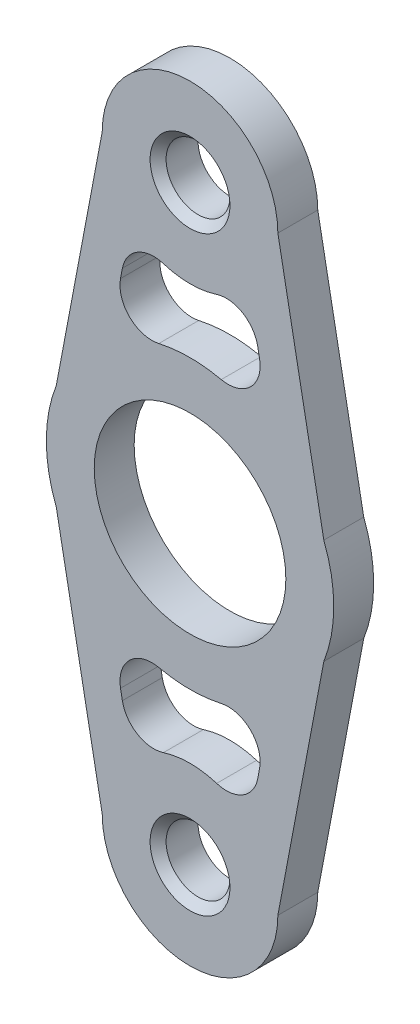
ISO-10303-21;
HEADER;
FILE_DESCRIPTION(('STEP AP214'),'2;1');
FILE_NAME('part.step','',(''),(''),'','','');
FILE_SCHEMA(('AUTOMOTIVE_DESIGN { 1 0 10303 214 1 1 1 1 }'));
ENDSEC;
DATA;
#1=APPLICATION_CONTEXT('core data for automotive mechanical design processes');
#2=APPLICATION_PROTOCOL_DEFINITION('international standard','automotive_design',2000,#1);
#3=PRODUCT_CONTEXT('',#1,'mechanical');
#4=PRODUCT('Part','Part','',(#3));
#5=PRODUCT_RELATED_PRODUCT_CATEGORY('part','',(#4));
#6=PRODUCT_DEFINITION_FORMATION('','',#4);
#7=PRODUCT_DEFINITION_CONTEXT('part definition',#1,'design');
#8=PRODUCT_DEFINITION('design','',#6,#7);
#9=PRODUCT_DEFINITION_SHAPE('','',#8);
#10=(LENGTH_UNIT() NAMED_UNIT(*) SI_UNIT(.MILLI.,.METRE.));
#11=(NAMED_UNIT(*) PLANE_ANGLE_UNIT() SI_UNIT($,.RADIAN.));
#12=(NAMED_UNIT(*) SI_UNIT($,.STERADIAN.) SOLID_ANGLE_UNIT());
#13=UNCERTAINTY_MEASURE_WITH_UNIT(LENGTH_MEASURE(1.E-05),#10,'distance_accuracy_value','');
#14=(GEOMETRIC_REPRESENTATION_CONTEXT(3) GLOBAL_UNCERTAINTY_ASSIGNED_CONTEXT((#13)) GLOBAL_UNIT_ASSIGNED_CONTEXT((#10,
#11,#12)) REPRESENTATION_CONTEXT('',''));
#15=CARTESIAN_POINT('',(0.,0.,0.));
#16=DIRECTION('',(0.,0.,1.));
#17=DIRECTION('',(1.,0.,0.));
#18=AXIS2_PLACEMENT_3D('',#15,#16,#17);
#19=CARTESIAN_POINT('',(0.,37.,5.));
#20=DIRECTION('',(0.,0.,1.));
#21=DIRECTION('',(1.,0.,0.));
#22=AXIS2_PLACEMENT_3D('',#19,#20,#21);
#23=PLANE('',#22);
#24=CARTESIAN_POINT('',(0.,-37.,5.));
#25=DIRECTION('',(0.,0.,1.));
#26=DIRECTION('',(1.,0.,0.));
#27=AXIS2_PLACEMENT_3D('',#24,#25,#26);
#28=CIRCLE('',#27,5.00000000000002);
#29=CARTESIAN_POINT('',(5.00000000000002,-37.,5.));
#30=VERTEX_POINT('',#29);
#31=EDGE_CURVE('E50',#30,#30,#28,.F.);
#32=ORIENTED_EDGE('',*,*,#31,.T.);
#33=EDGE_LOOP('',(#32));
#34=FACE_BOUND('',#33,.T.);
#35=CARTESIAN_POINT('',(0.,37.,5.));
#36=DIRECTION('',(0.,0.,1.));
#37=DIRECTION('',(1.,0.,0.));
#38=AXIS2_PLACEMENT_3D('',#35,#36,#37);
#39=CIRCLE('',#38,5.00000000000002);
#40=CARTESIAN_POINT('',(5.00000000000002,37.,5.));
#41=VERTEX_POINT('',#40);
#42=EDGE_CURVE('E399',#41,#41,#39,.F.);
#43=ORIENTED_EDGE('',*,*,#42,.T.);
#44=EDGE_LOOP('',(#43));
#45=FACE_BOUND('',#44,.T.);
#46=CARTESIAN_POINT('',(0.,0.,5.));
#47=DIRECTION('',(0.,0.,-1.));
#48=DIRECTION('',(1.,0.,0.));
#49=AXIS2_PLACEMENT_3D('',#46,#47,#48);
#50=CIRCLE('',#49,18.);
#51=CARTESIAN_POINT('',(3.90887412794151,-17.570449711146,5.));
#52=VERTEX_POINT('',#51);
#53=CARTESIAN_POINT('',(-3.90887412794152,-17.570449711146,5.));
#54=VERTEX_POINT('',#53);
#55=EDGE_CURVE('E211',#52,#54,#50,.T.);
#56=ORIENTED_EDGE('',*,*,#55,.F.);
#57=CARTESIAN_POINT('',(4.77751282303963,-21.4749940914006,5.));
#58=DIRECTION('',(0.,0.,1.));
#59=DIRECTION('',(1.,0.,0.));
#60=AXIS2_PLACEMENT_3D('',#57,#58,#59);
#61=CIRCLE('',#60,4.);
#62=CARTESIAN_POINT('',(8.7077938058279,-22.21856076382,5.));
#63=VERTEX_POINT('',#62);
#64=EDGE_CURVE('E203',#63,#52,#61,.T.);
#65=ORIENTED_EDGE('',*,*,#64,.F.);
#66=DIRECTION('',(0.185891668104852,0.982570245697068,0.));
#67=VECTOR('',#66,1.);
#68=CARTESIAN_POINT('',(8.47507554235507,-23.448643013605,5.));
#69=LINE('',#68,#67);
#70=CARTESIAN_POINT('',(8.47507554235507,-23.448643013605,5.));
#71=VERTEX_POINT('',#70);
#72=EDGE_CURVE('E238',#71,#63,#69,.T.);
#73=ORIENTED_EDGE('',*,*,#72,.F.);
#74=CARTESIAN_POINT('',(4.54479455956681,-22.7050763411856,5.));
#75=DIRECTION('',(0.,0.,1.));
#76=DIRECTION('',(1.,0.,0.));
#77=AXIS2_PLACEMENT_3D('',#74,#75,#76);
#78=CIRCLE('',#77,4.);
#79=CARTESIAN_POINT('',(3.33284934368232,-26.5170559835361,5.));
#80=VERTEX_POINT('',#79);
#81=EDGE_CURVE('E236',#80,#71,#78,.T.);
#82=ORIENTED_EDGE('',*,*,#81,.F.);
#83=CARTESIAN_POINT('',(0.,-37.,5.));
#84=DIRECTION('',(0.,0.,-1.));
#85=DIRECTION('',(-1.,0.,0.));
#86=AXIS2_PLACEMENT_3D('',#83,#84,#85);
#87=CIRCLE('',#86,11.);
#88=CARTESIAN_POINT('',(-3.33284934368232,-26.5170559835361,5.));
#89=VERTEX_POINT('',#88);
#90=EDGE_CURVE('E234',#89,#80,#87,.T.);
#91=ORIENTED_EDGE('',*,*,#90,.F.);
#92=CARTESIAN_POINT('',(-4.54479455956681,-22.7050763411856,5.));
#93=DIRECTION('',(0.,0.,1.));
#94=DIRECTION('',(-1.,0.,0.));
#95=AXIS2_PLACEMENT_3D('',#92,#93,#94);
#96=CIRCLE('',#95,4.);
#97=CARTESIAN_POINT('',(-8.47507554235507,-23.448643013605,5.));
#98=VERTEX_POINT('',#97);
#99=EDGE_CURVE('E232',#98,#89,#96,.T.);
#100=ORIENTED_EDGE('',*,*,#99,.F.);
#101=DIRECTION('',(0.185891668104852,-0.982570245697068,0.));
#102=VECTOR('',#101,1.);
#103=CARTESIAN_POINT('',(-8.47507554235507,-23.448643013605,5.));
#104=LINE('',#103,#102);
#105=CARTESIAN_POINT('',(-8.7077938058279,-22.21856076382,5.));
#106=VERTEX_POINT('',#105);
#107=EDGE_CURVE('E227',#106,#98,#104,.T.);
#108=ORIENTED_EDGE('',*,*,#107,.F.);
#109=CARTESIAN_POINT('',(-4.77751282303963,-21.4749940914006,5.));
#110=DIRECTION('',(0.,0.,1.));
#111=DIRECTION('',(-1.,0.,0.));
#112=AXIS2_PLACEMENT_3D('',#109,#110,#111);
#113=CIRCLE('',#112,4.);
#114=EDGE_CURVE('E225',#54,#106,#113,.T.);
#115=ORIENTED_EDGE('',*,*,#114,.F.);
#116=EDGE_LOOP('',(#56,#65,#73,#82,#91,#100,#108,#115));
#117=FACE_BOUND('',#116,.T.);
#118=CARTESIAN_POINT('',(0.,37.,5.));
#119=DIRECTION('',(0.,0.,-1.));
#120=DIRECTION('',(1.,0.,0.));
#121=AXIS2_PLACEMENT_3D('',#118,#119,#120);
#122=CIRCLE('',#121,11.);
#123=CARTESIAN_POINT('',(3.33284934368232,26.5170559835361,5.));
#124=VERTEX_POINT('',#123);
#125=CARTESIAN_POINT('',(-3.33284934368233,26.5170559835361,5.));
#126=VERTEX_POINT('',#125);
#127=EDGE_CURVE('E273',#124,#126,#122,.T.);
#128=ORIENTED_EDGE('',*,*,#127,.F.);
#129=CARTESIAN_POINT('',(4.54479455956681,22.7050763411856,5.));
#130=DIRECTION('',(0.,0.,1.));
#131=DIRECTION('',(-1.,0.,0.));
#132=AXIS2_PLACEMENT_3D('',#129,#130,#131);
#133=CIRCLE('',#132,4.);
#134=CARTESIAN_POINT('',(8.47507554235507,23.448643013605,5.));
#135=VERTEX_POINT('',#134);
#136=EDGE_CURVE('E271',#135,#124,#133,.T.);
#137=ORIENTED_EDGE('',*,*,#136,.F.);
#138=DIRECTION('',(-0.185891668104852,0.982570245697068,0.));
#139=VECTOR('',#138,1.);
#140=CARTESIAN_POINT('',(8.47507554235507,23.448643013605,5.));
#141=LINE('',#140,#139);
#142=CARTESIAN_POINT('',(8.7077938058279,22.21856076382,5.));
#143=VERTEX_POINT('',#142);
#144=EDGE_CURVE('E287',#143,#135,#141,.T.);
#145=ORIENTED_EDGE('',*,*,#144,.F.);
#146=CARTESIAN_POINT('',(4.77751282303963,21.4749940914006,5.));
#147=DIRECTION('',(0.,0.,1.));
#148=DIRECTION('',(-1.,0.,0.));
#149=AXIS2_PLACEMENT_3D('',#146,#147,#148);
#150=CIRCLE('',#149,4.);
#151=CARTESIAN_POINT('',(3.90887412794152,17.570449711146,5.));
#152=VERTEX_POINT('',#151);
#153=EDGE_CURVE('E284',#152,#143,#150,.T.);
#154=ORIENTED_EDGE('',*,*,#153,.F.);
#155=CARTESIAN_POINT('',(0.,0.,5.));
#156=DIRECTION('',(0.,0.,-1.));
#157=DIRECTION('',(1.,0.,0.));
#158=AXIS2_PLACEMENT_3D('',#155,#156,#157);
#159=CIRCLE('',#158,18.);
#160=CARTESIAN_POINT('',(-3.90887412794152,17.570449711146,5.));
#161=VERTEX_POINT('',#160);
#162=EDGE_CURVE('E282',#161,#152,#159,.T.);
#163=ORIENTED_EDGE('',*,*,#162,.F.);
#164=CARTESIAN_POINT('',(-4.77751282303963,21.4749940914006,5.));
#165=DIRECTION('',(0.,0.,1.));
#166=DIRECTION('',(1.,0.,0.));
#167=AXIS2_PLACEMENT_3D('',#164,#165,#166);
#168=CIRCLE('',#167,4.);
#169=CARTESIAN_POINT('',(-8.7077938058279,22.21856076382,5.));
#170=VERTEX_POINT('',#169);
#171=EDGE_CURVE('E280',#170,#161,#168,.T.);
#172=ORIENTED_EDGE('',*,*,#171,.F.);
#173=DIRECTION('',(-0.185891668104852,-0.982570245697068,0.));
#174=VECTOR('',#173,1.);
#175=CARTESIAN_POINT('',(-8.47507554235507,23.448643013605,5.));
#176=LINE('',#175,#174);
#177=CARTESIAN_POINT('',(-8.47507554235507,23.448643013605,5.));
#178=VERTEX_POINT('',#177);
#179=EDGE_CURVE('E278',#178,#170,#176,.T.);
#180=ORIENTED_EDGE('',*,*,#179,.F.);
#181=CARTESIAN_POINT('',(-4.54479455956681,22.7050763411856,5.));
#182=DIRECTION('',(0.,0.,1.));
#183=DIRECTION('',(1.,0.,0.));
#184=AXIS2_PLACEMENT_3D('',#181,#182,#183);
#185=CIRCLE('',#184,4.);
#186=EDGE_CURVE('E276',#126,#178,#185,.T.);
#187=ORIENTED_EDGE('',*,*,#186,.F.);
#188=EDGE_LOOP('',(#128,#137,#145,#154,#163,#172,#180,#187));
#189=FACE_BOUND('',#188,.T.);
#190=CARTESIAN_POINT('',(0.,37.,5.));
#191=DIRECTION('',(0.,0.,1.));
#192=DIRECTION('',(1.,0.,0.));
#193=AXIS2_PLACEMENT_3D('',#190,#191,#192);
#194=CIRCLE('',#193,11.);
#195=CARTESIAN_POINT('',(11.,37.,5.));
#196=VERTEX_POINT('',#195);
#197=CARTESIAN_POINT('',(-11.,37.,5.));
#198=VERTEX_POINT('',#197);
#199=EDGE_CURVE('E339',#196,#198,#194,.T.);
#200=ORIENTED_EDGE('',*,*,#199,.T.);
#201=DIRECTION('',(-0.185891668104851,-0.982570245697068,0.));
#202=VECTOR('',#201,1.);
#203=CARTESIAN_POINT('',(-16.7559943582511,6.57545839210155,5.));
#204=LINE('',#203,#202);
#205=CARTESIAN_POINT('',(-16.7559943582511,6.57545839210155,5.));
#206=VERTEX_POINT('',#205);
#207=EDGE_CURVE('E342',#198,#206,#204,.T.);
#208=ORIENTED_EDGE('',*,*,#207,.T.);
#209=CARTESIAN_POINT('',(0.,0.,5.));
#210=DIRECTION('',(0.,0.,1.));
#211=DIRECTION('',(1.,0.,0.));
#212=AXIS2_PLACEMENT_3D('',#209,#210,#211);
#213=CIRCLE('',#212,18.);
#214=CARTESIAN_POINT('',(-16.7559943582511,-6.57545839210154,5.));
#215=VERTEX_POINT('',#214);
#216=EDGE_CURVE('E345',#206,#215,#213,.T.);
#217=ORIENTED_EDGE('',*,*,#216,.T.);
#218=DIRECTION('',(0.185891668104851,-0.982570245697068,0.));
#219=VECTOR('',#218,1.);
#220=CARTESIAN_POINT('',(-16.7559943582511,-6.57545839210154,5.));
#221=LINE('',#220,#219);
#222=CARTESIAN_POINT('',(-11.,-37.,5.));
#223=VERTEX_POINT('',#222);
#224=EDGE_CURVE('E347',#215,#223,#221,.T.);
#225=ORIENTED_EDGE('',*,*,#224,.T.);
#226=CARTESIAN_POINT('',(0.,-37.,5.));
#227=DIRECTION('',(0.,0.,1.));
#228=DIRECTION('',(-1.,0.,0.));
#229=AXIS2_PLACEMENT_3D('',#226,#227,#228);
#230=CIRCLE('',#229,11.);
#231=CARTESIAN_POINT('',(11.,-37.,5.));
#232=VERTEX_POINT('',#231);
#233=EDGE_CURVE('E349',#223,#232,#230,.T.);
#234=ORIENTED_EDGE('',*,*,#233,.T.);
#235=DIRECTION('',(0.185891668104851,0.982570245697068,0.));
#236=VECTOR('',#235,1.);
#237=CARTESIAN_POINT('',(16.7559943582511,-6.57545839210155,5.));
#238=LINE('',#237,#236);
#239=CARTESIAN_POINT('',(16.7559943582511,-6.57545839210155,5.));
#240=VERTEX_POINT('',#239);
#241=EDGE_CURVE('E351',#232,#240,#238,.T.);
#242=ORIENTED_EDGE('',*,*,#241,.T.);
#243=CARTESIAN_POINT('',(0.,0.,5.));
#244=DIRECTION('',(0.,0.,1.));
#245=DIRECTION('',(1.,0.,0.));
#246=AXIS2_PLACEMENT_3D('',#243,#244,#245);
#247=CIRCLE('',#246,18.);
#248=CARTESIAN_POINT('',(16.7559943582511,6.57545839210154,5.));
#249=VERTEX_POINT('',#248);
#250=EDGE_CURVE('E353',#240,#249,#247,.T.);
#251=ORIENTED_EDGE('',*,*,#250,.T.);
#252=DIRECTION('',(-0.185891668104851,0.982570245697068,0.));
#253=VECTOR('',#252,1.);
#254=CARTESIAN_POINT('',(16.7559943582511,6.57545839210155,5.));
#255=LINE('',#254,#253);
#256=EDGE_CURVE('E355',#249,#196,#255,.T.);
#257=ORIENTED_EDGE('',*,*,#256,.T.);
#258=EDGE_LOOP('',(#200,#208,#217,#225,#234,#242,#251,#257));
#259=FACE_BOUND('',#258,.T.);
#260=CARTESIAN_POINT('',(0.,0.,5.));
#261=DIRECTION('',(0.,0.,1.));
#262=DIRECTION('',(1.,0.,0.));
#263=AXIS2_PLACEMENT_3D('',#260,#261,#262);
#264=CIRCLE('',#263,12.);
#265=CARTESIAN_POINT('',(12.,0.,5.));
#266=VERTEX_POINT('',#265);
#267=EDGE_CURVE('E333',#266,#266,#264,.T.);
#268=ORIENTED_EDGE('',*,*,#267,.F.);
#269=EDGE_LOOP('',(#268));
#270=FACE_BOUND('',#269,.T.);
#271=ADVANCED_FACE('F41',(#34,#45,#117,#189,#259,#270),#23,.T.);
#272=CARTESIAN_POINT('',(0.,37.,0.));
#273=DIRECTION('',(0.,0.,1.));
#274=DIRECTION('',(1.,0.,0.));
#275=AXIS2_PLACEMENT_3D('',#272,#273,#274);
#276=PLANE('',#275);
#277=CARTESIAN_POINT('',(4.54479455956681,22.7050763411856,0.));
#278=DIRECTION('',(0.,0.,1.));
#279=DIRECTION('',(-1.,0.,0.));
#280=AXIS2_PLACEMENT_3D('',#277,#278,#279);
#281=CIRCLE('',#280,4.);
#282=CARTESIAN_POINT('',(8.47507554235507,23.448643013605,0.));
#283=VERTEX_POINT('',#282);
#284=CARTESIAN_POINT('',(3.33284934368232,26.5170559835361,0.));
#285=VERTEX_POINT('',#284);
#286=EDGE_CURVE('E219',#283,#285,#281,.T.);
#287=ORIENTED_EDGE('',*,*,#286,.T.);
#288=CARTESIAN_POINT('',(0.,37.,0.));
#289=DIRECTION('',(0.,0.,-1.));
#290=DIRECTION('',(1.,0.,0.));
#291=AXIS2_PLACEMENT_3D('',#288,#289,#290);
#292=CIRCLE('',#291,11.);
#293=CARTESIAN_POINT('',(-3.33284934368233,26.5170559835361,0.));
#294=VERTEX_POINT('',#293);
#295=EDGE_CURVE('E292',#285,#294,#292,.T.);
#296=ORIENTED_EDGE('',*,*,#295,.T.);
#297=CARTESIAN_POINT('',(-4.54479455956681,22.7050763411856,0.));
#298=DIRECTION('',(0.,0.,1.));
#299=DIRECTION('',(1.,0.,0.));
#300=AXIS2_PLACEMENT_3D('',#297,#298,#299);
#301=CIRCLE('',#300,4.);
#302=CARTESIAN_POINT('',(-8.47507554235507,23.448643013605,0.));
#303=VERTEX_POINT('',#302);
#304=EDGE_CURVE('E295',#294,#303,#301,.T.);
#305=ORIENTED_EDGE('',*,*,#304,.T.);
#306=DIRECTION('',(-0.185891668104852,-0.982570245697068,0.));
#307=VECTOR('',#306,1.);
#308=CARTESIAN_POINT('',(-8.47507554235507,23.448643013605,0.));
#309=LINE('',#308,#307);
#310=CARTESIAN_POINT('',(-8.7077938058279,22.21856076382,0.));
#311=VERTEX_POINT('',#310);
#312=EDGE_CURVE('E298',#303,#311,#309,.T.);
#313=ORIENTED_EDGE('',*,*,#312,.T.);
#314=CARTESIAN_POINT('',(-4.77751282303963,21.4749940914006,0.));
#315=DIRECTION('',(0.,0.,1.));
#316=DIRECTION('',(1.,0.,0.));
#317=AXIS2_PLACEMENT_3D('',#314,#315,#316);
#318=CIRCLE('',#317,4.);
#319=CARTESIAN_POINT('',(-3.90887412794152,17.570449711146,0.));
#320=VERTEX_POINT('',#319);
#321=EDGE_CURVE('E301',#311,#320,#318,.T.);
#322=ORIENTED_EDGE('',*,*,#321,.T.);
#323=CARTESIAN_POINT('',(0.,0.,0.));
#324=DIRECTION('',(0.,0.,-1.));
#325=DIRECTION('',(1.,0.,0.));
#326=AXIS2_PLACEMENT_3D('',#323,#324,#325);
#327=CIRCLE('',#326,18.);
#328=CARTESIAN_POINT('',(3.90887412794152,17.570449711146,0.));
#329=VERTEX_POINT('',#328);
#330=EDGE_CURVE('E304',#320,#329,#327,.T.);
#331=ORIENTED_EDGE('',*,*,#330,.T.);
#332=CARTESIAN_POINT('',(4.77751282303963,21.4749940914006,0.));
#333=DIRECTION('',(0.,0.,1.));
#334=DIRECTION('',(-1.,0.,0.));
#335=AXIS2_PLACEMENT_3D('',#332,#333,#334);
#336=CIRCLE('',#335,4.);
#337=CARTESIAN_POINT('',(8.7077938058279,22.21856076382,0.));
#338=VERTEX_POINT('',#337);
#339=EDGE_CURVE('E307',#329,#338,#336,.T.);
#340=ORIENTED_EDGE('',*,*,#339,.T.);
#341=DIRECTION('',(-0.185891668104852,0.982570245697068,0.));
#342=VECTOR('',#341,1.);
#343=CARTESIAN_POINT('',(8.47507554235507,23.448643013605,0.));
#344=LINE('',#343,#342);
#345=EDGE_CURVE('E274',#338,#283,#344,.T.);
#346=ORIENTED_EDGE('',*,*,#345,.T.);
#347=EDGE_LOOP('',(#287,#296,#305,#313,#322,#331,#340,#346));
#348=FACE_BOUND('',#347,.T.);
#349=CARTESIAN_POINT('',(0.,37.,0.));
#350=DIRECTION('',(0.,0.,1.));
#351=DIRECTION('',(1.,0.,0.));
#352=AXIS2_PLACEMENT_3D('',#349,#350,#351);
#353=CIRCLE('',#352,11.);
#354=CARTESIAN_POINT('',(11.,37.,0.));
#355=VERTEX_POINT('',#354);
#356=CARTESIAN_POINT('',(-11.,37.,0.));
#357=VERTEX_POINT('',#356);
#358=EDGE_CURVE('E336',#355,#357,#353,.T.);
#359=ORIENTED_EDGE('',*,*,#358,.F.);
#360=DIRECTION('',(-0.185891668104851,0.982570245697068,0.));
#361=VECTOR('',#360,1.);
#362=CARTESIAN_POINT('',(16.7559943582511,6.57545839210155,0.));
#363=LINE('',#362,#361);
#364=CARTESIAN_POINT('',(16.7559943582511,6.57545839210154,0.));
#365=VERTEX_POINT('',#364);
#366=EDGE_CURVE('E343',#365,#355,#363,.T.);
#367=ORIENTED_EDGE('',*,*,#366,.F.);
#368=CARTESIAN_POINT('',(0.,0.,0.));
#369=DIRECTION('',(0.,0.,1.));
#370=DIRECTION('',(1.,0.,0.));
#371=AXIS2_PLACEMENT_3D('',#368,#369,#370);
#372=CIRCLE('',#371,18.);
#373=CARTESIAN_POINT('',(16.7559943582511,-6.57545839210155,0.));
#374=VERTEX_POINT('',#373);
#375=EDGE_CURVE('E370',#374,#365,#372,.T.);
#376=ORIENTED_EDGE('',*,*,#375,.F.);
#377=DIRECTION('',(0.185891668104851,0.982570245697068,0.));
#378=VECTOR('',#377,1.);
#379=CARTESIAN_POINT('',(16.7559943582511,-6.57545839210155,0.));
#380=LINE('',#379,#378);
#381=CARTESIAN_POINT('',(11.,-37.,0.));
#382=VERTEX_POINT('',#381);
#383=EDGE_CURVE('E368',#382,#374,#380,.T.);
#384=ORIENTED_EDGE('',*,*,#383,.F.);
#385=CARTESIAN_POINT('',(0.,-37.,0.));
#386=DIRECTION('',(0.,0.,1.));
#387=DIRECTION('',(-1.,0.,0.));
#388=AXIS2_PLACEMENT_3D('',#385,#386,#387);
#389=CIRCLE('',#388,11.);
#390=CARTESIAN_POINT('',(-11.,-37.,0.));
#391=VERTEX_POINT('',#390);
#392=EDGE_CURVE('E366',#391,#382,#389,.T.);
#393=ORIENTED_EDGE('',*,*,#392,.F.);
#394=DIRECTION('',(0.185891668104851,-0.982570245697068,0.));
#395=VECTOR('',#394,1.);
#396=CARTESIAN_POINT('',(-16.7559943582511,-6.57545839210154,0.));
#397=LINE('',#396,#395);
#398=CARTESIAN_POINT('',(-16.7559943582511,-6.57545839210154,0.));
#399=VERTEX_POINT('',#398);
#400=EDGE_CURVE('E364',#399,#391,#397,.T.);
#401=ORIENTED_EDGE('',*,*,#400,.F.);
#402=CARTESIAN_POINT('',(0.,0.,0.));
#403=DIRECTION('',(0.,0.,1.));
#404=DIRECTION('',(1.,0.,0.));
#405=AXIS2_PLACEMENT_3D('',#402,#403,#404);
#406=CIRCLE('',#405,18.);
#407=CARTESIAN_POINT('',(-16.7559943582511,6.57545839210155,0.));
#408=VERTEX_POINT('',#407);
#409=EDGE_CURVE('E362',#408,#399,#406,.T.);
#410=ORIENTED_EDGE('',*,*,#409,.F.);
#411=DIRECTION('',(-0.185891668104851,-0.982570245697068,0.));
#412=VECTOR('',#411,1.);
#413=CARTESIAN_POINT('',(-16.7559943582511,6.57545839210155,0.));
#414=LINE('',#413,#412);
#415=EDGE_CURVE('E360',#357,#408,#414,.T.);
#416=ORIENTED_EDGE('',*,*,#415,.F.);
#417=EDGE_LOOP('',(#359,#367,#376,#384,#393,#401,#410,#416));
#418=FACE_BOUND('',#417,.T.);
#419=CARTESIAN_POINT('',(0.,0.,0.));
#420=DIRECTION('',(0.,0.,1.));
#421=DIRECTION('',(1.,0.,0.));
#422=AXIS2_PLACEMENT_3D('',#419,#420,#421);
#423=CIRCLE('',#422,12.);
#424=CARTESIAN_POINT('',(12.,0.,0.));
#425=VERTEX_POINT('',#424);
#426=EDGE_CURVE('E332',#425,#425,#423,.T.);
#427=ORIENTED_EDGE('',*,*,#426,.T.);
#428=EDGE_LOOP('',(#427));
#429=FACE_BOUND('',#428,.T.);
#430=CARTESIAN_POINT('',(0.,37.,0.));
#431=DIRECTION('',(0.,0.,1.));
#432=DIRECTION('',(1.,0.,0.));
#433=AXIS2_PLACEMENT_3D('',#430,#431,#432);
#434=CIRCLE('',#433,4.);
#435=CARTESIAN_POINT('',(4.,37.,0.));
#436=VERTEX_POINT('',#435);
#437=EDGE_CURVE('E329',#436,#436,#434,.T.);
#438=ORIENTED_EDGE('',*,*,#437,.T.);
#439=EDGE_LOOP('',(#438));
#440=FACE_BOUND('',#439,.T.);
#441=CARTESIAN_POINT('',(4.77751282303963,-21.4749940914006,0.));
#442=DIRECTION('',(0.,0.,1.));
#443=DIRECTION('',(1.,0.,0.));
#444=AXIS2_PLACEMENT_3D('',#441,#442,#443);
#445=CIRCLE('',#444,4.);
#446=CARTESIAN_POINT('',(8.7077938058279,-22.21856076382,0.));
#447=VERTEX_POINT('',#446);
#448=CARTESIAN_POINT('',(3.90887412794151,-17.570449711146,0.));
#449=VERTEX_POINT('',#448);
#450=EDGE_CURVE('E65',#447,#449,#445,.T.);
#451=ORIENTED_EDGE('',*,*,#450,.T.);
#452=CARTESIAN_POINT('',(0.,0.,0.));
#453=DIRECTION('',(0.,0.,-1.));
#454=DIRECTION('',(1.,0.,0.));
#455=AXIS2_PLACEMENT_3D('',#452,#453,#454);
#456=CIRCLE('',#455,18.);
#457=CARTESIAN_POINT('',(-3.90887412794152,-17.570449711146,0.));
#458=VERTEX_POINT('',#457);
#459=EDGE_CURVE('E218',#449,#458,#456,.T.);
#460=ORIENTED_EDGE('',*,*,#459,.T.);
#461=CARTESIAN_POINT('',(-4.77751282303963,-21.4749940914006,0.));
#462=DIRECTION('',(0.,0.,1.));
#463=DIRECTION('',(-1.,0.,0.));
#464=AXIS2_PLACEMENT_3D('',#461,#462,#463);
#465=CIRCLE('',#464,4.);
#466=CARTESIAN_POINT('',(-8.7077938058279,-22.21856076382,0.));
#467=VERTEX_POINT('',#466);
#468=EDGE_CURVE('E243',#458,#467,#465,.T.);
#469=ORIENTED_EDGE('',*,*,#468,.T.);
#470=DIRECTION('',(0.185891668104852,-0.982570245697068,0.));
#471=VECTOR('',#470,1.);
#472=CARTESIAN_POINT('',(-8.47507554235507,-23.448643013605,0.));
#473=LINE('',#472,#471);
#474=CARTESIAN_POINT('',(-8.47507554235507,-23.448643013605,0.));
#475=VERTEX_POINT('',#474);
#476=EDGE_CURVE('E246',#467,#475,#473,.T.);
#477=ORIENTED_EDGE('',*,*,#476,.T.);
#478=CARTESIAN_POINT('',(-4.54479455956681,-22.7050763411856,0.));
#479=DIRECTION('',(0.,0.,1.));
#480=DIRECTION('',(-1.,0.,0.));
#481=AXIS2_PLACEMENT_3D('',#478,#479,#480);
#482=CIRCLE('',#481,4.);
#483=CARTESIAN_POINT('',(-3.33284934368232,-26.5170559835361,0.));
#484=VERTEX_POINT('',#483);
#485=EDGE_CURVE('E249',#475,#484,#482,.T.);
#486=ORIENTED_EDGE('',*,*,#485,.T.);
#487=CARTESIAN_POINT('',(0.,-37.,0.));
#488=DIRECTION('',(0.,0.,-1.));
#489=DIRECTION('',(-1.,0.,0.));
#490=AXIS2_PLACEMENT_3D('',#487,#488,#489);
#491=CIRCLE('',#490,11.);
#492=CARTESIAN_POINT('',(3.33284934368232,-26.5170559835361,0.));
#493=VERTEX_POINT('',#492);
#494=EDGE_CURVE('E252',#484,#493,#491,.T.);
#495=ORIENTED_EDGE('',*,*,#494,.T.);
#496=CARTESIAN_POINT('',(4.54479455956681,-22.7050763411856,0.));
#497=DIRECTION('',(0.,0.,1.));
#498=DIRECTION('',(1.,0.,0.));
#499=AXIS2_PLACEMENT_3D('',#496,#497,#498);
#500=CIRCLE('',#499,4.);
#501=CARTESIAN_POINT('',(8.47507554235507,-23.448643013605,0.));
#502=VERTEX_POINT('',#501);
#503=EDGE_CURVE('E255',#493,#502,#500,.T.);
#504=ORIENTED_EDGE('',*,*,#503,.T.);
#505=DIRECTION('',(0.185891668104852,0.982570245697068,0.));
#506=VECTOR('',#505,1.);
#507=CARTESIAN_POINT('',(8.47507554235507,-23.448643013605,0.));
#508=LINE('',#507,#506);
#509=EDGE_CURVE('E212',#502,#447,#508,.T.);
#510=ORIENTED_EDGE('',*,*,#509,.T.);
#511=EDGE_LOOP('',(#451,#460,#469,#477,#486,#495,#504,#510));
#512=FACE_BOUND('',#511,.T.);
#513=CARTESIAN_POINT('',(0.,-37.,0.));
#514=DIRECTION('',(0.,0.,1.));
#515=DIRECTION('',(-1.,0.,0.));
#516=AXIS2_PLACEMENT_3D('',#513,#514,#515);
#517=CIRCLE('',#516,4.);
#518=CARTESIAN_POINT('',(-4.,-37.,0.));
#519=VERTEX_POINT('',#518);
#520=EDGE_CURVE('E241',#519,#519,#517,.T.);
#521=ORIENTED_EDGE('',*,*,#520,.T.);
#522=EDGE_LOOP('',(#521));
#523=FACE_BOUND('',#522,.T.);
#524=ADVANCED_FACE('F419',(#348,#418,#429,#440,#512,#523),#276,.F.);
#525=CARTESIAN_POINT('',(0.,37.,5.));
#526=DIRECTION('',(0.,0.,-1.));
#527=DIRECTION('',(-1.,0.,0.));
#528=AXIS2_PLACEMENT_3D('',#525,#526,#527);
#529=CYLINDRICAL_SURFACE('',#528,11.);
#530=ORIENTED_EDGE('',*,*,#358,.T.);
#531=DIRECTION('',(0.,0.,-1.));
#532=VECTOR('',#531,1.);
#533=CARTESIAN_POINT('',(-11.,37.,5.));
#534=LINE('',#533,#532);
#535=EDGE_CURVE('E393',#198,#357,#534,.T.);
#536=ORIENTED_EDGE('',*,*,#535,.F.);
#537=ORIENTED_EDGE('',*,*,#199,.F.);
#538=DIRECTION('',(0.,0.,-1.));
#539=VECTOR('',#538,1.);
#540=CARTESIAN_POINT('',(11.,37.,5.));
#541=LINE('',#540,#539);
#542=EDGE_CURVE('E357',#196,#355,#541,.T.);
#543=ORIENTED_EDGE('',*,*,#542,.T.);
#544=EDGE_LOOP('',(#530,#536,#537,#543));
#545=FACE_BOUND('',#544,.T.);
#546=ADVANCED_FACE('F421',(#545),#529,.T.);
#547=CARTESIAN_POINT('',(-16.7559943582511,6.57545839210155,5.));
#548=DIRECTION('',(0.982570245697068,-0.185891668104851,0.));
#549=DIRECTION('',(0.185891668104851,0.982570245697068,0.));
#550=AXIS2_PLACEMENT_3D('',#547,#548,#549);
#551=PLANE('',#550);
#552=ORIENTED_EDGE('',*,*,#415,.T.);
#553=DIRECTION('',(0.,0.,-1.));
#554=VECTOR('',#553,1.);
#555=CARTESIAN_POINT('',(-16.7559943582511,6.57545839210155,5.));
#556=LINE('',#555,#554);
#557=EDGE_CURVE('E390',#206,#408,#556,.T.);
#558=ORIENTED_EDGE('',*,*,#557,.F.);
#559=ORIENTED_EDGE('',*,*,#207,.F.);
#560=ORIENTED_EDGE('',*,*,#535,.T.);
#561=EDGE_LOOP('',(#552,#558,#559,#560));
#562=FACE_BOUND('',#561,.T.);
#563=ADVANCED_FACE('F427',(#562),#551,.F.);
#564=CARTESIAN_POINT('',(0.,0.,5.));
#565=DIRECTION('',(0.,0.,-1.));
#566=DIRECTION('',(-1.,0.,0.));
#567=AXIS2_PLACEMENT_3D('',#564,#565,#566);
#568=CYLINDRICAL_SURFACE('',#567,18.);
#569=ORIENTED_EDGE('',*,*,#409,.T.);
#570=DIRECTION('',(0.,0.,-1.));
#571=VECTOR('',#570,1.);
#572=CARTESIAN_POINT('',(-16.7559943582511,-6.57545839210154,5.));
#573=LINE('',#572,#571);
#574=EDGE_CURVE('E387',#215,#399,#573,.T.);
#575=ORIENTED_EDGE('',*,*,#574,.F.);
#576=ORIENTED_EDGE('',*,*,#216,.F.);
#577=ORIENTED_EDGE('',*,*,#557,.T.);
#578=EDGE_LOOP('',(#569,#575,#576,#577));
#579=FACE_BOUND('',#578,.T.);
#580=ADVANCED_FACE('F455',(#579),#568,.T.);
#581=CARTESIAN_POINT('',(-16.7559943582511,-6.57545839210154,5.));
#582=DIRECTION('',(0.982570245697068,0.185891668104851,0.));
#583=DIRECTION('',(-0.185891668104851,0.982570245697068,0.));
#584=AXIS2_PLACEMENT_3D('',#581,#582,#583);
#585=PLANE('',#584);
#586=ORIENTED_EDGE('',*,*,#400,.T.);
#587=DIRECTION('',(0.,0.,-1.));
#588=VECTOR('',#587,1.);
#589=CARTESIAN_POINT('',(-11.,-37.,5.));
#590=LINE('',#589,#588);
#591=EDGE_CURVE('E384',#223,#391,#590,.T.);
#592=ORIENTED_EDGE('',*,*,#591,.F.);
#593=ORIENTED_EDGE('',*,*,#224,.F.);
#594=ORIENTED_EDGE('',*,*,#574,.T.);
#595=EDGE_LOOP('',(#586,#592,#593,#594));
#596=FACE_BOUND('',#595,.T.);
#597=ADVANCED_FACE('F451',(#596),#585,.F.);
#598=CARTESIAN_POINT('',(0.,-37.,5.));
#599=DIRECTION('',(0.,0.,-1.));
#600=DIRECTION('',(-1.,0.,0.));
#601=AXIS2_PLACEMENT_3D('',#598,#599,#600);
#602=CYLINDRICAL_SURFACE('',#601,11.);
#603=ORIENTED_EDGE('',*,*,#392,.T.);
#604=DIRECTION('',(0.,0.,-1.));
#605=VECTOR('',#604,1.);
#606=CARTESIAN_POINT('',(11.,-37.,5.));
#607=LINE('',#606,#605);
#608=EDGE_CURVE('E381',#232,#382,#607,.T.);
#609=ORIENTED_EDGE('',*,*,#608,.F.);
#610=ORIENTED_EDGE('',*,*,#233,.F.);
#611=ORIENTED_EDGE('',*,*,#591,.T.);
#612=EDGE_LOOP('',(#603,#609,#610,#611));
#613=FACE_BOUND('',#612,.T.);
#614=ADVANCED_FACE('F447',(#613),#602,.T.);
#615=CARTESIAN_POINT('',(16.7559943582511,-6.57545839210155,5.));
#616=DIRECTION('',(-0.982570245697068,0.185891668104851,0.));
#617=DIRECTION('',(-0.185891668104851,-0.982570245697068,0.));
#618=AXIS2_PLACEMENT_3D('',#615,#616,#617);
#619=PLANE('',#618);
#620=ORIENTED_EDGE('',*,*,#383,.T.);
#621=DIRECTION('',(0.,0.,-1.));
#622=VECTOR('',#621,1.);
#623=CARTESIAN_POINT('',(16.7559943582511,-6.57545839210155,5.));
#624=LINE('',#623,#622);
#625=EDGE_CURVE('E378',#240,#374,#624,.T.);
#626=ORIENTED_EDGE('',*,*,#625,.F.);
#627=ORIENTED_EDGE('',*,*,#241,.F.);
#628=ORIENTED_EDGE('',*,*,#608,.T.);
#629=EDGE_LOOP('',(#620,#626,#627,#628));
#630=FACE_BOUND('',#629,.T.);
#631=ADVANCED_FACE('F443',(#630),#619,.F.);
#632=CARTESIAN_POINT('',(0.,0.,5.));
#633=DIRECTION('',(0.,0.,-1.));
#634=DIRECTION('',(-1.,0.,0.));
#635=AXIS2_PLACEMENT_3D('',#632,#633,#634);
#636=CYLINDRICAL_SURFACE('',#635,18.);
#637=ORIENTED_EDGE('',*,*,#375,.T.);
#638=DIRECTION('',(0.,0.,-1.));
#639=VECTOR('',#638,1.);
#640=CARTESIAN_POINT('',(16.7559943582511,6.57545839210154,5.));
#641=LINE('',#640,#639);
#642=EDGE_CURVE('E375',#249,#365,#641,.T.);
#643=ORIENTED_EDGE('',*,*,#642,.F.);
#644=ORIENTED_EDGE('',*,*,#250,.F.);
#645=ORIENTED_EDGE('',*,*,#625,.T.);
#646=EDGE_LOOP('',(#637,#643,#644,#645));
#647=FACE_BOUND('',#646,.T.);
#648=ADVANCED_FACE('F439',(#647),#636,.T.);
#649=CARTESIAN_POINT('',(16.7559943582511,6.57545839210155,5.));
#650=DIRECTION('',(-0.982570245697068,-0.185891668104851,0.));
#651=DIRECTION('',(0.185891668104851,-0.982570245697068,0.));
#652=AXIS2_PLACEMENT_3D('',#649,#650,#651);
#653=PLANE('',#652);
#654=ORIENTED_EDGE('',*,*,#366,.T.);
#655=ORIENTED_EDGE('',*,*,#542,.F.);
#656=ORIENTED_EDGE('',*,*,#256,.F.);
#657=ORIENTED_EDGE('',*,*,#642,.T.);
#658=EDGE_LOOP('',(#654,#655,#656,#657));
#659=FACE_BOUND('',#658,.T.);
#660=ADVANCED_FACE('F435',(#659),#653,.F.);
#661=CARTESIAN_POINT('',(0.,0.,5.));
#662=DIRECTION('',(0.,0.,-1.));
#663=DIRECTION('',(-1.,0.,0.));
#664=AXIS2_PLACEMENT_3D('',#661,#662,#663);
#665=CYLINDRICAL_SURFACE('',#664,12.);
#666=ORIENTED_EDGE('',*,*,#267,.T.);
#667=EDGE_LOOP('',(#666));
#668=FACE_BOUND('',#667,.T.);
#669=ORIENTED_EDGE('',*,*,#426,.F.);
#670=EDGE_LOOP('',(#669));
#671=FACE_BOUND('',#670,.T.);
#672=ADVANCED_FACE('F438',(#668,#671),#665,.F.);
#673=CARTESIAN_POINT('',(0.,37.,5.));
#674=DIRECTION('',(0.,0.,-1.));
#675=DIRECTION('',(-1.,0.,0.));
#676=AXIS2_PLACEMENT_3D('',#673,#674,#675);
#677=CYLINDRICAL_SURFACE('',#676,4.);
#678=CARTESIAN_POINT('',(0.,37.,3.99999999999998));
#679=DIRECTION('',(0.,0.,1.));
#680=DIRECTION('',(1.,0.,0.));
#681=AXIS2_PLACEMENT_3D('',#678,#679,#680);
#682=CIRCLE('',#681,4.);
#683=CARTESIAN_POINT('',(4.,37.,3.99999999999998));
#684=VERTEX_POINT('',#683);
#685=EDGE_CURVE('E11',#684,#684,#682,.T.);
#686=ORIENTED_EDGE('',*,*,#685,.T.);
#687=EDGE_LOOP('',(#686));
#688=FACE_BOUND('',#687,.T.);
#689=ORIENTED_EDGE('',*,*,#437,.F.);
#690=EDGE_LOOP('',(#689));
#691=FACE_BOUND('',#690,.T.);
#692=ADVANCED_FACE('F498',(#688,#691),#677,.F.);
#693=CARTESIAN_POINT('',(4.54479455956681,22.7050763411856,5.));
#694=DIRECTION('',(0.,0.,-1.));
#695=DIRECTION('',(-1.,0.,0.));
#696=AXIS2_PLACEMENT_3D('',#693,#694,#695);
#697=CYLINDRICAL_SURFACE('',#696,4.);
#698=ORIENTED_EDGE('',*,*,#286,.F.);
#699=DIRECTION('',(0.,0.,-1.));
#700=VECTOR('',#699,1.);
#701=CARTESIAN_POINT('',(8.47507554235507,23.448643013605,5.));
#702=LINE('',#701,#700);
#703=EDGE_CURVE('E289',#135,#283,#702,.T.);
#704=ORIENTED_EDGE('',*,*,#703,.F.);
#705=ORIENTED_EDGE('',*,*,#136,.T.);
#706=DIRECTION('',(0.,0.,-1.));
#707=VECTOR('',#706,1.);
#708=CARTESIAN_POINT('',(3.33284934368232,26.5170559835361,5.));
#709=LINE('',#708,#707);
#710=EDGE_CURVE('E326',#124,#285,#709,.T.);
#711=ORIENTED_EDGE('',*,*,#710,.T.);
#712=EDGE_LOOP('',(#698,#704,#705,#711));
#713=FACE_BOUND('',#712,.T.);
#714=ADVANCED_FACE('F564',(#713),#697,.F.);
#715=CARTESIAN_POINT('',(0.,37.,5.));
#716=DIRECTION('',(0.,0.,-1.));
#717=DIRECTION('',(-1.,0.,0.));
#718=AXIS2_PLACEMENT_3D('',#715,#716,#717);
#719=CYLINDRICAL_SURFACE('',#718,11.);
#720=ORIENTED_EDGE('',*,*,#295,.F.);
#721=ORIENTED_EDGE('',*,*,#710,.F.);
#722=ORIENTED_EDGE('',*,*,#127,.T.);
#723=DIRECTION('',(0.,0.,-1.));
#724=VECTOR('',#723,1.);
#725=CARTESIAN_POINT('',(-3.33284934368233,26.5170559835361,5.));
#726=LINE('',#725,#724);
#727=EDGE_CURVE('E324',#126,#294,#726,.T.);
#728=ORIENTED_EDGE('',*,*,#727,.T.);
#729=EDGE_LOOP('',(#720,#721,#722,#728));
#730=FACE_BOUND('',#729,.T.);
#731=ADVANCED_FACE('F560',(#730),#719,.T.);
#732=CARTESIAN_POINT('',(-4.54479455956681,22.7050763411856,5.));
#733=DIRECTION('',(0.,0.,-1.));
#734=DIRECTION('',(-1.,0.,0.));
#735=AXIS2_PLACEMENT_3D('',#732,#733,#734);
#736=CYLINDRICAL_SURFACE('',#735,4.);
#737=ORIENTED_EDGE('',*,*,#304,.F.);
#738=ORIENTED_EDGE('',*,*,#727,.F.);
#739=ORIENTED_EDGE('',*,*,#186,.T.);
#740=DIRECTION('',(0.,0.,-1.));
#741=VECTOR('',#740,1.);
#742=CARTESIAN_POINT('',(-8.47507554235507,23.448643013605,5.));
#743=LINE('',#742,#741);
#744=EDGE_CURVE('E322',#178,#303,#743,.T.);
#745=ORIENTED_EDGE('',*,*,#744,.T.);
#746=EDGE_LOOP('',(#737,#738,#739,#745));
#747=FACE_BOUND('',#746,.T.);
#748=ADVANCED_FACE('F556',(#747),#736,.F.);
#749=CARTESIAN_POINT('',(-8.47507554235507,23.448643013605,5.));
#750=DIRECTION('',(0.982570245697068,-0.185891668104852,0.));
#751=DIRECTION('',(0.185891668104851,0.982570245697068,0.));
#752=AXIS2_PLACEMENT_3D('',#749,#750,#751);
#753=PLANE('',#752);
#754=ORIENTED_EDGE('',*,*,#312,.F.);
#755=ORIENTED_EDGE('',*,*,#744,.F.);
#756=ORIENTED_EDGE('',*,*,#179,.T.);
#757=DIRECTION('',(0.,0.,-1.));
#758=VECTOR('',#757,1.);
#759=CARTESIAN_POINT('',(-8.7077938058279,22.21856076382,5.));
#760=LINE('',#759,#758);
#761=EDGE_CURVE('E320',#170,#311,#760,.T.);
#762=ORIENTED_EDGE('',*,*,#761,.T.);
#763=EDGE_LOOP('',(#754,#755,#756,#762));
#764=FACE_BOUND('',#763,.T.);
#765=ADVANCED_FACE('F552',(#764),#753,.T.);
#766=CARTESIAN_POINT('',(-4.77751282303963,21.4749940914006,5.));
#767=DIRECTION('',(0.,0.,-1.));
#768=DIRECTION('',(-1.,0.,0.));
#769=AXIS2_PLACEMENT_3D('',#766,#767,#768);
#770=CYLINDRICAL_SURFACE('',#769,4.);
#771=ORIENTED_EDGE('',*,*,#321,.F.);
#772=ORIENTED_EDGE('',*,*,#761,.F.);
#773=ORIENTED_EDGE('',*,*,#171,.T.);
#774=DIRECTION('',(0.,0.,-1.));
#775=VECTOR('',#774,1.);
#776=CARTESIAN_POINT('',(-3.90887412794152,17.570449711146,5.));
#777=LINE('',#776,#775);
#778=EDGE_CURVE('E318',#161,#320,#777,.T.);
#779=ORIENTED_EDGE('',*,*,#778,.T.);
#780=EDGE_LOOP('',(#771,#772,#773,#779));
#781=FACE_BOUND('',#780,.T.);
#782=ADVANCED_FACE('F548',(#781),#770,.F.);
#783=CARTESIAN_POINT('',(0.,0.,5.));
#784=DIRECTION('',(0.,0.,-1.));
#785=DIRECTION('',(-1.,0.,0.));
#786=AXIS2_PLACEMENT_3D('',#783,#784,#785);
#787=CYLINDRICAL_SURFACE('',#786,18.);
#788=ORIENTED_EDGE('',*,*,#330,.F.);
#789=ORIENTED_EDGE('',*,*,#778,.F.);
#790=ORIENTED_EDGE('',*,*,#162,.T.);
#791=DIRECTION('',(0.,0.,-1.));
#792=VECTOR('',#791,1.);
#793=CARTESIAN_POINT('',(3.90887412794152,17.570449711146,5.));
#794=LINE('',#793,#792);
#795=EDGE_CURVE('E316',#152,#329,#794,.T.);
#796=ORIENTED_EDGE('',*,*,#795,.T.);
#797=EDGE_LOOP('',(#788,#789,#790,#796));
#798=FACE_BOUND('',#797,.T.);
#799=ADVANCED_FACE('F544',(#798),#787,.T.);
#800=CARTESIAN_POINT('',(4.77751282303963,21.4749940914006,5.));
#801=DIRECTION('',(0.,0.,-1.));
#802=DIRECTION('',(-1.,0.,0.));
#803=AXIS2_PLACEMENT_3D('',#800,#801,#802);
#804=CYLINDRICAL_SURFACE('',#803,4.);
#805=ORIENTED_EDGE('',*,*,#339,.F.);
#806=ORIENTED_EDGE('',*,*,#795,.F.);
#807=ORIENTED_EDGE('',*,*,#153,.T.);
#808=DIRECTION('',(0.,0.,-1.));
#809=VECTOR('',#808,1.);
#810=CARTESIAN_POINT('',(8.7077938058279,22.21856076382,5.));
#811=LINE('',#810,#809);
#812=EDGE_CURVE('E314',#143,#338,#811,.T.);
#813=ORIENTED_EDGE('',*,*,#812,.T.);
#814=EDGE_LOOP('',(#805,#806,#807,#813));
#815=FACE_BOUND('',#814,.T.);
#816=ADVANCED_FACE('F540',(#815),#804,.F.);
#817=CARTESIAN_POINT('',(8.47507554235507,23.448643013605,5.));
#818=DIRECTION('',(-0.982570245697068,-0.185891668104852,0.));
#819=DIRECTION('',(0.185891668104851,-0.982570245697068,0.));
#820=AXIS2_PLACEMENT_3D('',#817,#818,#819);
#821=PLANE('',#820);
#822=ORIENTED_EDGE('',*,*,#345,.F.);
#823=ORIENTED_EDGE('',*,*,#812,.F.);
#824=ORIENTED_EDGE('',*,*,#144,.T.);
#825=ORIENTED_EDGE('',*,*,#703,.T.);
#826=EDGE_LOOP('',(#822,#823,#824,#825));
#827=FACE_BOUND('',#826,.T.);
#828=ADVANCED_FACE('F537',(#827),#821,.T.);
#829=CARTESIAN_POINT('',(4.77751282303963,-21.4749940914006,5.));
#830=DIRECTION('',(0.,0.,-1.));
#831=DIRECTION('',(-1.,0.,0.));
#832=AXIS2_PLACEMENT_3D('',#829,#830,#831);
#833=CYLINDRICAL_SURFACE('',#832,4.);
#834=ORIENTED_EDGE('',*,*,#450,.F.);
#835=DIRECTION('',(0.,0.,-1.));
#836=VECTOR('',#835,1.);
#837=CARTESIAN_POINT('',(8.7077938058279,-22.21856076382,5.));
#838=LINE('',#837,#836);
#839=EDGE_CURVE('E207',#63,#447,#838,.T.);
#840=ORIENTED_EDGE('',*,*,#839,.F.);
#841=ORIENTED_EDGE('',*,*,#64,.T.);
#842=DIRECTION('',(0.,0.,-1.));
#843=VECTOR('',#842,1.);
#844=CARTESIAN_POINT('',(3.90887412794151,-17.570449711146,5.));
#845=LINE('',#844,#843);
#846=EDGE_CURVE('E206',#52,#449,#845,.T.);
#847=ORIENTED_EDGE('',*,*,#846,.T.);
#848=EDGE_LOOP('',(#834,#840,#841,#847));
#849=FACE_BOUND('',#848,.T.);
#850=ADVANCED_FACE('F205',(#849),#833,.F.);
#851=CARTESIAN_POINT('',(0.,0.,5.));
#852=DIRECTION('',(0.,0.,-1.));
#853=DIRECTION('',(-1.,0.,0.));
#854=AXIS2_PLACEMENT_3D('',#851,#852,#853);
#855=CYLINDRICAL_SURFACE('',#854,18.);
#856=ORIENTED_EDGE('',*,*,#459,.F.);
#857=ORIENTED_EDGE('',*,*,#846,.F.);
#858=ORIENTED_EDGE('',*,*,#55,.T.);
#859=DIRECTION('',(0.,0.,-1.));
#860=VECTOR('',#859,1.);
#861=CARTESIAN_POINT('',(-3.90887412794152,-17.570449711146,5.));
#862=LINE('',#861,#860);
#863=EDGE_CURVE('E220',#54,#458,#862,.T.);
#864=ORIENTED_EDGE('',*,*,#863,.T.);
#865=EDGE_LOOP('',(#856,#857,#858,#864));
#866=FACE_BOUND('',#865,.T.);
#867=ADVANCED_FACE('F215',(#866),#855,.T.);
#868=CARTESIAN_POINT('',(-4.77751282303963,-21.4749940914006,5.));
#869=DIRECTION('',(0.,0.,-1.));
#870=DIRECTION('',(-1.,0.,0.));
#871=AXIS2_PLACEMENT_3D('',#868,#869,#870);
#872=CYLINDRICAL_SURFACE('',#871,4.);
#873=ORIENTED_EDGE('',*,*,#468,.F.);
#874=ORIENTED_EDGE('',*,*,#863,.F.);
#875=ORIENTED_EDGE('',*,*,#114,.T.);
#876=DIRECTION('',(0.,0.,-1.));
#877=VECTOR('',#876,1.);
#878=CARTESIAN_POINT('',(-8.7077938058279,-22.21856076382,5.));
#879=LINE('',#878,#877);
#880=EDGE_CURVE('E268',#106,#467,#879,.T.);
#881=ORIENTED_EDGE('',*,*,#880,.T.);
#882=EDGE_LOOP('',(#873,#874,#875,#881));
#883=FACE_BOUND('',#882,.T.);
#884=ADVANCED_FACE('F524',(#883),#872,.F.);
#885=CARTESIAN_POINT('',(-8.47507554235507,-23.448643013605,5.));
#886=DIRECTION('',(0.982570245697068,0.185891668104852,0.));
#887=DIRECTION('',(-0.185891668104851,0.982570245697068,0.));
#888=AXIS2_PLACEMENT_3D('',#885,#886,#887);
#889=PLANE('',#888);
#890=ORIENTED_EDGE('',*,*,#476,.F.);
#891=ORIENTED_EDGE('',*,*,#880,.F.);
#892=ORIENTED_EDGE('',*,*,#107,.T.);
#893=DIRECTION('',(0.,0.,-1.));
#894=VECTOR('',#893,1.);
#895=CARTESIAN_POINT('',(-8.47507554235507,-23.448643013605,5.));
#896=LINE('',#895,#894);
#897=EDGE_CURVE('E266',#98,#475,#896,.T.);
#898=ORIENTED_EDGE('',*,*,#897,.T.);
#899=EDGE_LOOP('',(#890,#891,#892,#898));
#900=FACE_BOUND('',#899,.T.);
#901=ADVANCED_FACE('F521',(#900),#889,.T.);
#902=CARTESIAN_POINT('',(-4.54479455956681,-22.7050763411856,5.));
#903=DIRECTION('',(0.,0.,-1.));
#904=DIRECTION('',(-1.,0.,0.));
#905=AXIS2_PLACEMENT_3D('',#902,#903,#904);
#906=CYLINDRICAL_SURFACE('',#905,4.);
#907=ORIENTED_EDGE('',*,*,#485,.F.);
#908=ORIENTED_EDGE('',*,*,#897,.F.);
#909=ORIENTED_EDGE('',*,*,#99,.T.);
#910=DIRECTION('',(0.,0.,-1.));
#911=VECTOR('',#910,1.);
#912=CARTESIAN_POINT('',(-3.33284934368232,-26.5170559835361,5.));
#913=LINE('',#912,#911);
#914=EDGE_CURVE('E264',#89,#484,#913,.T.);
#915=ORIENTED_EDGE('',*,*,#914,.T.);
#916=EDGE_LOOP('',(#907,#908,#909,#915));
#917=FACE_BOUND('',#916,.T.);
#918=ADVANCED_FACE('F516',(#917),#906,.F.);
#919=CARTESIAN_POINT('',(0.,-37.,5.));
#920=DIRECTION('',(0.,0.,-1.));
#921=DIRECTION('',(-1.,0.,0.));
#922=AXIS2_PLACEMENT_3D('',#919,#920,#921);
#923=CYLINDRICAL_SURFACE('',#922,11.);
#924=ORIENTED_EDGE('',*,*,#494,.F.);
#925=ORIENTED_EDGE('',*,*,#914,.F.);
#926=ORIENTED_EDGE('',*,*,#90,.T.);
#927=DIRECTION('',(0.,0.,-1.));
#928=VECTOR('',#927,1.);
#929=CARTESIAN_POINT('',(3.33284934368232,-26.5170559835361,5.));
#930=LINE('',#929,#928);
#931=EDGE_CURVE('E262',#80,#493,#930,.T.);
#932=ORIENTED_EDGE('',*,*,#931,.T.);
#933=EDGE_LOOP('',(#924,#925,#926,#932));
#934=FACE_BOUND('',#933,.T.);
#935=ADVANCED_FACE('F512',(#934),#923,.T.);
#936=CARTESIAN_POINT('',(4.54479455956681,-22.7050763411856,5.));
#937=DIRECTION('',(0.,0.,-1.));
#938=DIRECTION('',(-1.,0.,0.));
#939=AXIS2_PLACEMENT_3D('',#936,#937,#938);
#940=CYLINDRICAL_SURFACE('',#939,4.);
#941=ORIENTED_EDGE('',*,*,#503,.F.);
#942=ORIENTED_EDGE('',*,*,#931,.F.);
#943=ORIENTED_EDGE('',*,*,#81,.T.);
#944=DIRECTION('',(0.,0.,-1.));
#945=VECTOR('',#944,1.);
#946=CARTESIAN_POINT('',(8.47507554235507,-23.448643013605,5.));
#947=LINE('',#946,#945);
#948=EDGE_CURVE('E57',#71,#502,#947,.T.);
#949=ORIENTED_EDGE('',*,*,#948,.T.);
#950=EDGE_LOOP('',(#941,#942,#943,#949));
#951=FACE_BOUND('',#950,.T.);
#952=ADVANCED_FACE('F509',(#951),#940,.F.);
#953=CARTESIAN_POINT('',(8.47507554235507,-23.448643013605,5.));
#954=DIRECTION('',(-0.982570245697068,0.185891668104852,0.));
#955=DIRECTION('',(-0.185891668104851,-0.982570245697068,0.));
#956=AXIS2_PLACEMENT_3D('',#953,#954,#955);
#957=PLANE('',#956);
#958=ORIENTED_EDGE('',*,*,#509,.F.);
#959=ORIENTED_EDGE('',*,*,#948,.F.);
#960=ORIENTED_EDGE('',*,*,#72,.T.);
#961=ORIENTED_EDGE('',*,*,#839,.T.);
#962=EDGE_LOOP('',(#958,#959,#960,#961));
#963=FACE_BOUND('',#962,.T.);
#964=ADVANCED_FACE('F414',(#963),#957,.T.);
#965=CARTESIAN_POINT('',(0.,-37.,5.));
#966=DIRECTION('',(0.,0.,-1.));
#967=DIRECTION('',(-1.,0.,0.));
#968=AXIS2_PLACEMENT_3D('',#965,#966,#967);
#969=CYLINDRICAL_SURFACE('',#968,4.);
#970=CARTESIAN_POINT('',(0.,-37.,3.99999999999998));
#971=DIRECTION('',(0.,0.,1.));
#972=DIRECTION('',(1.,0.,0.));
#973=AXIS2_PLACEMENT_3D('',#970,#971,#972);
#974=CIRCLE('',#973,4.);
#975=CARTESIAN_POINT('',(4.,-37.,3.99999999999998));
#976=VERTEX_POINT('',#975);
#977=EDGE_CURVE('E396',#976,#976,#974,.T.);
#978=ORIENTED_EDGE('',*,*,#977,.T.);
#979=EDGE_LOOP('',(#978));
#980=FACE_BOUND('',#979,.T.);
#981=ORIENTED_EDGE('',*,*,#520,.F.);
#982=EDGE_LOOP('',(#981));
#983=FACE_BOUND('',#982,.T.);
#984=ADVANCED_FACE('F409',(#980,#983),#969,.F.);
#985=CARTESIAN_POINT('',(0.,-37.,3.99999999999998));
#986=DIRECTION('',(0.,0.,1.));
#987=DIRECTION('',(1.,0.,0.));
#988=AXIS2_PLACEMENT_3D('',#985,#986,#987);
#989=CONICAL_SURFACE('',#988,4.,0.785398163397448);
#990=ORIENTED_EDGE('',*,*,#31,.F.);
#991=EDGE_LOOP('',(#990));
#992=FACE_BOUND('',#991,.T.);
#993=ORIENTED_EDGE('',*,*,#977,.F.);
#994=EDGE_LOOP('',(#993));
#995=FACE_BOUND('',#994,.T.);
#996=ADVANCED_FACE('F406',(#992,#995),#989,.F.);
#997=CARTESIAN_POINT('',(0.,37.,3.99999999999998));
#998=DIRECTION('',(0.,0.,1.));
#999=DIRECTION('',(1.,0.,0.));
#1000=AXIS2_PLACEMENT_3D('',#997,#998,#999);
#1001=CONICAL_SURFACE('',#1000,4.,0.785398163397448);
#1002=ORIENTED_EDGE('',*,*,#42,.F.);
#1003=EDGE_LOOP('',(#1002));
#1004=FACE_BOUND('',#1003,.T.);
#1005=ORIENTED_EDGE('',*,*,#685,.F.);
#1006=EDGE_LOOP('',(#1005));
#1007=FACE_BOUND('',#1006,.T.);
#1008=ADVANCED_FACE('F44',(#1004,#1007),#1001,.F.);
#1009=CLOSED_SHELL('',(#271,#524,#546,#563,#580,#597,#614,#631,#648,#660,#672,#692,#714,#731,
#748,#765,#782,#799,#816,#828,#850,#867,#884,#901,#918,#935,#952,#964,#984,#996,#1008));
#1010=MANIFOLD_SOLID_BREP('B2',#1009);
#1011=ADVANCED_BREP_SHAPE_REPRESENTATION('',(#18,#1010),#14);
#1012=SHAPE_DEFINITION_REPRESENTATION(#9,#1011);
ENDSEC;
END-ISO-10303-21;
